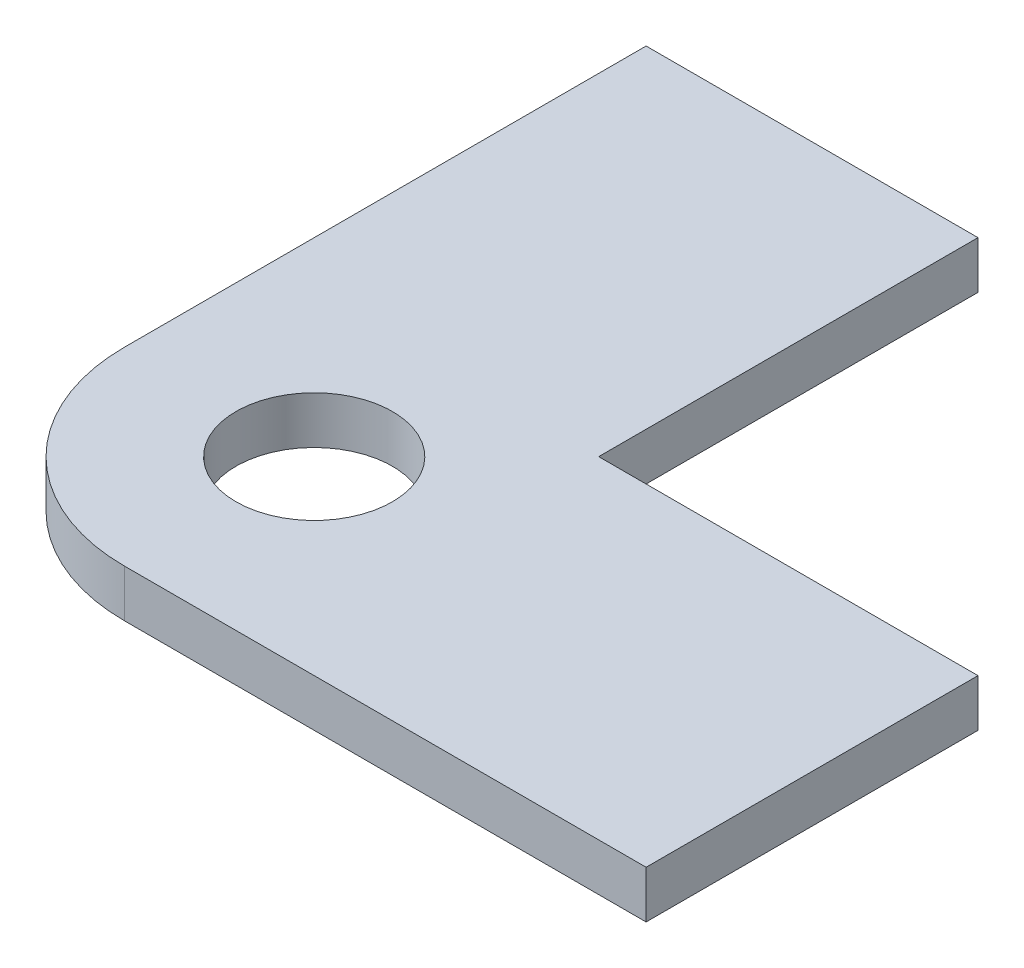
ISO-10303-21;
HEADER;
FILE_DESCRIPTION(('STEP AP214'),'2;1');
FILE_NAME('part.step','',(''),(''),'','','');
FILE_SCHEMA(('AUTOMOTIVE_DESIGN { 1 0 10303 214 1 1 1 1 }'));
ENDSEC;
DATA;
#1=APPLICATION_CONTEXT('core data for automotive mechanical design processes');
#2=APPLICATION_PROTOCOL_DEFINITION('international standard','automotive_design',2000,#1);
#3=PRODUCT_CONTEXT('',#1,'mechanical');
#4=PRODUCT('Part','Part','',(#3));
#5=PRODUCT_RELATED_PRODUCT_CATEGORY('part','',(#4));
#6=PRODUCT_DEFINITION_FORMATION('','',#4);
#7=PRODUCT_DEFINITION_CONTEXT('part definition',#1,'design');
#8=PRODUCT_DEFINITION('design','',#6,#7);
#9=PRODUCT_DEFINITION_SHAPE('','',#8);
#10=(LENGTH_UNIT() NAMED_UNIT(*) SI_UNIT(.MILLI.,.METRE.));
#11=(NAMED_UNIT(*) PLANE_ANGLE_UNIT() SI_UNIT($,.RADIAN.));
#12=(NAMED_UNIT(*) SI_UNIT($,.STERADIAN.) SOLID_ANGLE_UNIT());
#13=UNCERTAINTY_MEASURE_WITH_UNIT(LENGTH_MEASURE(1.E-05),#10,'distance_accuracy_value','');
#14=(GEOMETRIC_REPRESENTATION_CONTEXT(3) GLOBAL_UNCERTAINTY_ASSIGNED_CONTEXT((#13)) GLOBAL_UNIT_ASSIGNED_CONTEXT((#10,
#11,#12)) REPRESENTATION_CONTEXT('',''));
#15=CARTESIAN_POINT('',(0.,0.,0.));
#16=DIRECTION('',(0.,0.,1.));
#17=DIRECTION('',(1.,0.,0.));
#18=AXIS2_PLACEMENT_3D('',#15,#16,#17);
#19=CARTESIAN_POINT('',(0.,1.,3.99967418048264));
#20=DIRECTION('',(0.,0.,-1.));
#21=DIRECTION('',(-1.,0.,0.));
#22=AXIS2_PLACEMENT_3D('',#19,#20,#21);
#23=PLANE('',#22);
#24=DIRECTION('',(1.,0.,0.));
#25=VECTOR('',#24,1.);
#26=CARTESIAN_POINT('',(0.,0.,3.99967418048264));
#27=LINE('',#26,#25);
#28=CARTESIAN_POINT('',(0.,0.,3.99967418048264));
#29=VERTEX_POINT('',#28);
#30=CARTESIAN_POINT('',(11.,0.,3.99967418048264));
#31=VERTEX_POINT('',#30);
#32=EDGE_CURVE('E142',#29,#31,#27,.T.);
#33=ORIENTED_EDGE('',*,*,#32,.T.);
#34=DIRECTION('',(0.,-1.,0.));
#35=VECTOR('',#34,1.);
#36=CARTESIAN_POINT('',(11.,1.,3.99967418048264));
#37=LINE('',#36,#35);
#38=CARTESIAN_POINT('',(11.,1.,3.99967418048264));
#39=VERTEX_POINT('',#38);
#40=EDGE_CURVE('E11',#39,#31,#37,.T.);
#41=ORIENTED_EDGE('',*,*,#40,.F.);
#42=DIRECTION('',(1.,0.,0.));
#43=VECTOR('',#42,1.);
#44=CARTESIAN_POINT('',(0.,1.,3.99967418048264));
#45=LINE('',#44,#43);
#46=CARTESIAN_POINT('',(0.,1.,3.99967418048264));
#47=VERTEX_POINT('',#46);
#48=EDGE_CURVE('E170',#47,#39,#45,.T.);
#49=ORIENTED_EDGE('',*,*,#48,.F.);
#50=DIRECTION('',(0.,-1.,0.));
#51=VECTOR('',#50,1.);
#52=CARTESIAN_POINT('',(0.,1.,3.99967418048264));
#53=LINE('',#52,#51);
#54=EDGE_CURVE('E58',#47,#29,#53,.T.);
#55=ORIENTED_EDGE('',*,*,#54,.T.);
#56=EDGE_LOOP('',(#33,#41,#49,#55));
#57=FACE_BOUND('',#56,.T.);
#58=ADVANCED_FACE('F41',(#57),#23,.F.);
#59=CARTESIAN_POINT('',(11.,1.,0.));
#60=DIRECTION('',(-1.,0.,0.));
#61=DIRECTION('',(0.,0.,1.));
#62=AXIS2_PLACEMENT_3D('',#59,#60,#61);
#63=PLANE('',#62);
#64=DIRECTION('',(0.,0.,-1.));
#65=VECTOR('',#64,1.);
#66=CARTESIAN_POINT('',(11.,0.,0.));
#67=LINE('',#66,#65);
#68=CARTESIAN_POINT('',(11.,0.,-3.));
#69=VERTEX_POINT('',#68);
#70=EDGE_CURVE('E145',#31,#69,#67,.T.);
#71=ORIENTED_EDGE('',*,*,#70,.T.);
#72=DIRECTION('',(0.,-1.,0.));
#73=VECTOR('',#72,1.);
#74=CARTESIAN_POINT('',(11.,1.,-3.));
#75=LINE('',#74,#73);
#76=CARTESIAN_POINT('',(11.,1.,-3.));
#77=VERTEX_POINT('',#76);
#78=EDGE_CURVE('E50',#77,#69,#75,.T.);
#79=ORIENTED_EDGE('',*,*,#78,.F.);
#80=DIRECTION('',(0.,0.,-1.));
#81=VECTOR('',#80,1.);
#82=CARTESIAN_POINT('',(11.,1.,0.));
#83=LINE('',#82,#81);
#84=EDGE_CURVE('E93',#39,#77,#83,.T.);
#85=ORIENTED_EDGE('',*,*,#84,.F.);
#86=ORIENTED_EDGE('',*,*,#40,.T.);
#87=EDGE_LOOP('',(#71,#79,#85,#86));
#88=FACE_BOUND('',#87,.T.);
#89=ADVANCED_FACE('F185',(#88),#63,.F.);
#90=CARTESIAN_POINT('',(0.,1.,-3.));
#91=DIRECTION('',(0.,0.,-1.));
#92=DIRECTION('',(-1.,0.,0.));
#93=AXIS2_PLACEMENT_3D('',#90,#91,#92);
#94=PLANE('',#93);
#95=DIRECTION('',(1.,0.,0.));
#96=VECTOR('',#95,1.);
#97=CARTESIAN_POINT('',(0.,0.,-3.));
#98=LINE('',#97,#96);
#99=CARTESIAN_POINT('',(3.,0.,-3.));
#100=VERTEX_POINT('',#99);
#101=EDGE_CURVE('E149',#100,#69,#98,.T.);
#102=ORIENTED_EDGE('',*,*,#101,.F.);
#103=DIRECTION('',(0.,-1.,0.));
#104=VECTOR('',#103,1.);
#105=CARTESIAN_POINT('',(3.,1.,-3.));
#106=LINE('',#105,#104);
#107=CARTESIAN_POINT('',(3.,1.,-3.));
#108=VERTEX_POINT('',#107);
#109=EDGE_CURVE('E177',#108,#100,#106,.T.);
#110=ORIENTED_EDGE('',*,*,#109,.F.);
#111=DIRECTION('',(1.,0.,0.));
#112=VECTOR('',#111,1.);
#113=CARTESIAN_POINT('',(0.,1.,-3.));
#114=LINE('',#113,#112);
#115=EDGE_CURVE('E184',#108,#77,#114,.T.);
#116=ORIENTED_EDGE('',*,*,#115,.T.);
#117=ORIENTED_EDGE('',*,*,#78,.T.);
#118=EDGE_LOOP('',(#102,#110,#116,#117));
#119=FACE_BOUND('',#118,.T.);
#120=ADVANCED_FACE('F183',(#119),#94,.T.);
#121=CARTESIAN_POINT('',(3.,1.,0.));
#122=DIRECTION('',(1.,0.,0.));
#123=DIRECTION('',(0.,0.,-1.));
#124=AXIS2_PLACEMENT_3D('',#121,#122,#123);
#125=PLANE('',#124);
#126=DIRECTION('',(0.,0.,1.));
#127=VECTOR('',#126,1.);
#128=CARTESIAN_POINT('',(3.,0.,0.));
#129=LINE('',#128,#127);
#130=CARTESIAN_POINT('',(3.,0.,-11.));
#131=VERTEX_POINT('',#130);
#132=EDGE_CURVE('E153',#131,#100,#129,.T.);
#133=ORIENTED_EDGE('',*,*,#132,.F.);
#134=DIRECTION('',(0.,-1.,0.));
#135=VECTOR('',#134,1.);
#136=CARTESIAN_POINT('',(3.,1.,-11.));
#137=LINE('',#136,#135);
#138=CARTESIAN_POINT('',(3.,1.,-11.));
#139=VERTEX_POINT('',#138);
#140=EDGE_CURVE('E116',#139,#131,#137,.T.);
#141=ORIENTED_EDGE('',*,*,#140,.F.);
#142=DIRECTION('',(0.,0.,1.));
#143=VECTOR('',#142,1.);
#144=CARTESIAN_POINT('',(3.,1.,0.));
#145=LINE('',#144,#143);
#146=EDGE_CURVE('E127',#139,#108,#145,.T.);
#147=ORIENTED_EDGE('',*,*,#146,.T.);
#148=ORIENTED_EDGE('',*,*,#109,.T.);
#149=EDGE_LOOP('',(#133,#141,#147,#148));
#150=FACE_BOUND('',#149,.T.);
#151=ADVANCED_FACE('F192',(#150),#125,.T.);
#152=CARTESIAN_POINT('',(0.,1.,-11.));
#153=DIRECTION('',(0.,0.,-1.));
#154=DIRECTION('',(-1.,0.,0.));
#155=AXIS2_PLACEMENT_3D('',#152,#153,#154);
#156=PLANE('',#155);
#157=DIRECTION('',(1.,0.,0.));
#158=VECTOR('',#157,1.);
#159=CARTESIAN_POINT('',(0.,0.,-11.));
#160=LINE('',#159,#158);
#161=CARTESIAN_POINT('',(-3.99967418048264,0.,-11.));
#162=VERTEX_POINT('',#161);
#163=EDGE_CURVE('E111',#162,#131,#160,.T.);
#164=ORIENTED_EDGE('',*,*,#163,.F.);
#165=DIRECTION('',(0.,-1.,0.));
#166=VECTOR('',#165,1.);
#167=CARTESIAN_POINT('',(-3.99967418048264,1.,-11.));
#168=LINE('',#167,#166);
#169=CARTESIAN_POINT('',(-3.99967418048264,1.,-11.));
#170=VERTEX_POINT('',#169);
#171=EDGE_CURVE('E106',#170,#162,#168,.T.);
#172=ORIENTED_EDGE('',*,*,#171,.F.);
#173=DIRECTION('',(1.,0.,0.));
#174=VECTOR('',#173,1.);
#175=CARTESIAN_POINT('',(0.,1.,-11.));
#176=LINE('',#175,#174);
#177=EDGE_CURVE('E109',#170,#139,#176,.T.);
#178=ORIENTED_EDGE('',*,*,#177,.T.);
#179=ORIENTED_EDGE('',*,*,#140,.T.);
#180=EDGE_LOOP('',(#164,#172,#178,#179));
#181=FACE_BOUND('',#180,.T.);
#182=ADVANCED_FACE('F108',(#181),#156,.T.);
#183=CARTESIAN_POINT('',(-3.99967418048264,1.,0.));
#184=DIRECTION('',(-1.,0.,0.));
#185=DIRECTION('',(0.,0.,1.));
#186=AXIS2_PLACEMENT_3D('',#183,#184,#185);
#187=PLANE('',#186);
#188=DIRECTION('',(0.,0.,-1.));
#189=VECTOR('',#188,1.);
#190=CARTESIAN_POINT('',(-3.99967418048264,0.,0.));
#191=LINE('',#190,#189);
#192=CARTESIAN_POINT('',(-3.99967418048264,0.,0.));
#193=VERTEX_POINT('',#192);
#194=EDGE_CURVE('E159',#193,#162,#191,.T.);
#195=ORIENTED_EDGE('',*,*,#194,.F.);
#196=DIRECTION('',(0.,-1.,0.));
#197=VECTOR('',#196,1.);
#198=CARTESIAN_POINT('',(-3.99967418048264,1.,0.));
#199=LINE('',#198,#197);
#200=CARTESIAN_POINT('',(-3.99967418048264,1.,0.));
#201=VERTEX_POINT('',#200);
#202=EDGE_CURVE('E81',#201,#193,#199,.T.);
#203=ORIENTED_EDGE('',*,*,#202,.F.);
#204=DIRECTION('',(0.,0.,-1.));
#205=VECTOR('',#204,1.);
#206=CARTESIAN_POINT('',(-3.99967418048264,1.,0.));
#207=LINE('',#206,#205);
#208=EDGE_CURVE('E124',#201,#170,#207,.T.);
#209=ORIENTED_EDGE('',*,*,#208,.T.);
#210=ORIENTED_EDGE('',*,*,#171,.T.);
#211=EDGE_LOOP('',(#195,#203,#209,#210));
#212=FACE_BOUND('',#211,.T.);
#213=ADVANCED_FACE('F130',(#212),#187,.T.);
#214=CARTESIAN_POINT('',(0.,1.,0.));
#215=DIRECTION('',(0.,-1.,0.));
#216=DIRECTION('',(0.,0.,-1.));
#217=AXIS2_PLACEMENT_3D('',#214,#215,#216);
#218=CYLINDRICAL_SURFACE('',#217,3.99967418048264);
#219=CARTESIAN_POINT('',(0.,0.,0.));
#220=DIRECTION('',(0.,1.,0.));
#221=DIRECTION('',(0.,0.,1.));
#222=AXIS2_PLACEMENT_3D('',#219,#220,#221);
#223=CIRCLE('',#222,3.99967418048264);
#224=EDGE_CURVE('E162',#29,#193,#223,.F.);
#225=ORIENTED_EDGE('',*,*,#224,.F.);
#226=ORIENTED_EDGE('',*,*,#54,.F.);
#227=CARTESIAN_POINT('',(0.,1.,0.));
#228=DIRECTION('',(0.,1.,0.));
#229=DIRECTION('',(0.,0.,1.));
#230=AXIS2_PLACEMENT_3D('',#227,#228,#229);
#231=CIRCLE('',#230,3.99967418048264);
#232=EDGE_CURVE('E132',#47,#201,#231,.F.);
#233=ORIENTED_EDGE('',*,*,#232,.T.);
#234=ORIENTED_EDGE('',*,*,#202,.T.);
#235=EDGE_LOOP('',(#225,#226,#233,#234));
#236=FACE_BOUND('',#235,.T.);
#237=ADVANCED_FACE('F200',(#236),#218,.T.);
#238=CARTESIAN_POINT('',(0.,1.,0.));
#239=DIRECTION('',(0.,-1.,0.));
#240=DIRECTION('',(0.,0.,-1.));
#241=AXIS2_PLACEMENT_3D('',#238,#239,#240);
#242=CYLINDRICAL_SURFACE('',#241,1.65);
#243=CARTESIAN_POINT('',(0.,1.,0.));
#244=DIRECTION('',(0.,1.,0.));
#245=DIRECTION('',(0.,0.,1.));
#246=AXIS2_PLACEMENT_3D('',#243,#244,#245);
#247=CIRCLE('',#246,1.65);
#248=CARTESIAN_POINT('',(0.,1.,1.65));
#249=VERTEX_POINT('',#248);
#250=EDGE_CURVE('E135',#249,#249,#247,.T.);
#251=ORIENTED_EDGE('',*,*,#250,.T.);
#252=EDGE_LOOP('',(#251));
#253=FACE_BOUND('',#252,.T.);
#254=CARTESIAN_POINT('',(0.,0.,0.));
#255=DIRECTION('',(0.,1.,0.));
#256=DIRECTION('',(0.,0.,1.));
#257=AXIS2_PLACEMENT_3D('',#254,#255,#256);
#258=CIRCLE('',#257,1.65);
#259=CARTESIAN_POINT('',(0.,0.,1.65));
#260=VERTEX_POINT('',#259);
#261=EDGE_CURVE('E166',#260,#260,#258,.T.);
#262=ORIENTED_EDGE('',*,*,#261,.F.);
#263=EDGE_LOOP('',(#262));
#264=FACE_BOUND('',#263,.T.);
#265=ADVANCED_FACE('F202',(#253,#264),#242,.F.);
#266=CARTESIAN_POINT('',(0.,1.,0.));
#267=DIRECTION('',(0.,1.,0.));
#268=DIRECTION('',(0.,0.,1.));
#269=AXIS2_PLACEMENT_3D('',#266,#267,#268);
#270=PLANE('',#269);
#271=ORIENTED_EDGE('',*,*,#48,.T.);
#272=ORIENTED_EDGE('',*,*,#84,.T.);
#273=ORIENTED_EDGE('',*,*,#115,.F.);
#274=ORIENTED_EDGE('',*,*,#146,.F.);
#275=ORIENTED_EDGE('',*,*,#177,.F.);
#276=ORIENTED_EDGE('',*,*,#208,.F.);
#277=ORIENTED_EDGE('',*,*,#232,.F.);
#278=EDGE_LOOP('',(#271,#272,#273,#274,#275,#276,#277));
#279=FACE_BOUND('',#278,.T.);
#280=ORIENTED_EDGE('',*,*,#250,.F.);
#281=EDGE_LOOP('',(#280));
#282=FACE_BOUND('',#281,.T.);
#283=ADVANCED_FACE('F121',(#279,#282),#270,.T.);
#284=CARTESIAN_POINT('',(0.,0.,0.));
#285=DIRECTION('',(0.,1.,0.));
#286=DIRECTION('',(0.,0.,1.));
#287=AXIS2_PLACEMENT_3D('',#284,#285,#286);
#288=PLANE('',#287);
#289=ORIENTED_EDGE('',*,*,#32,.F.);
#290=ORIENTED_EDGE('',*,*,#224,.T.);
#291=ORIENTED_EDGE('',*,*,#194,.T.);
#292=ORIENTED_EDGE('',*,*,#163,.T.);
#293=ORIENTED_EDGE('',*,*,#132,.T.);
#294=ORIENTED_EDGE('',*,*,#101,.T.);
#295=ORIENTED_EDGE('',*,*,#70,.F.);
#296=EDGE_LOOP('',(#289,#290,#291,#292,#293,#294,#295));
#297=FACE_BOUND('',#296,.T.);
#298=ORIENTED_EDGE('',*,*,#261,.T.);
#299=EDGE_LOOP('',(#298));
#300=FACE_BOUND('',#299,.T.);
#301=ADVANCED_FACE('F188',(#297,#300),#288,.F.);
#302=CLOSED_SHELL('',(#58,#89,#120,#151,#182,#213,#237,#265,#283,#301));
#303=MANIFOLD_SOLID_BREP('B2',#302);
#304=ADVANCED_BREP_SHAPE_REPRESENTATION('',(#18,#303),#14);
#305=SHAPE_DEFINITION_REPRESENTATION(#9,#304);
ENDSEC;
END-ISO-10303-21;
